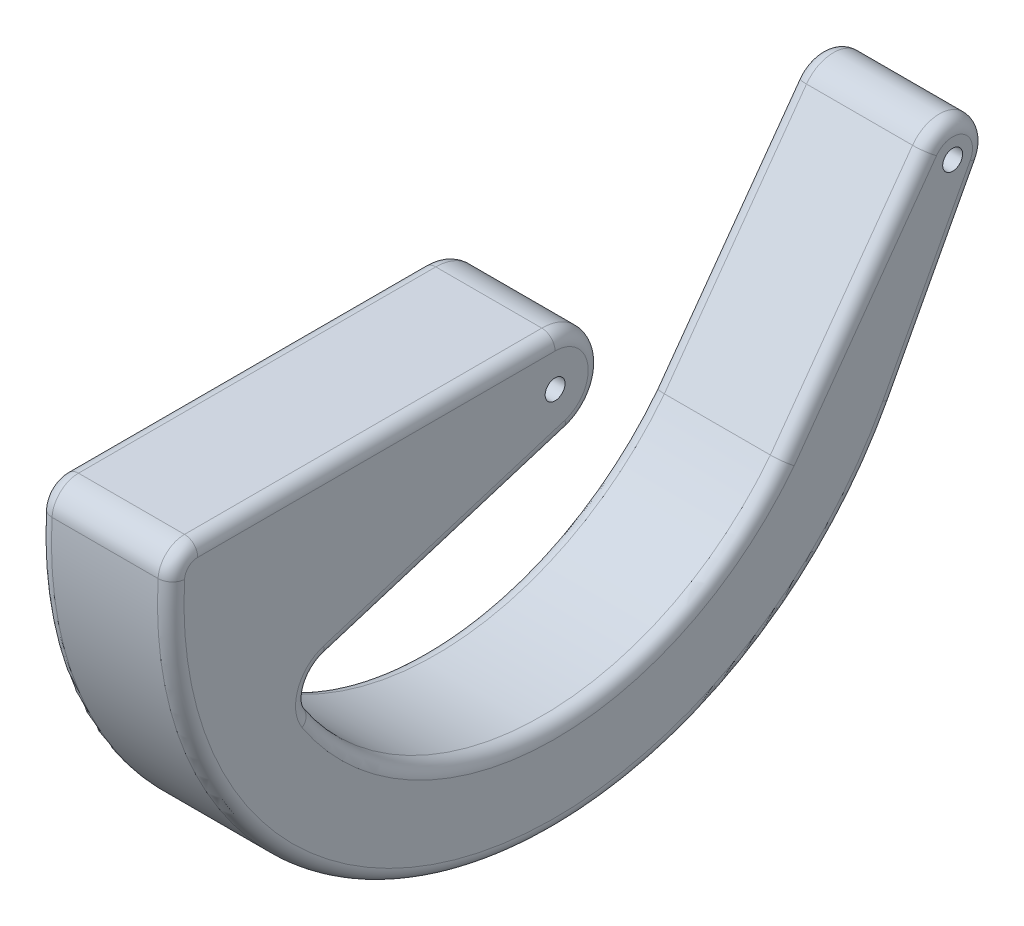
ISO-10303-21;
HEADER;
FILE_DESCRIPTION(('STEP AP214'),'2;1');
FILE_NAME('part.step','',(''),(''),'','','');
FILE_SCHEMA(('AUTOMOTIVE_DESIGN { 1 0 10303 214 1 1 1 1 }'));
ENDSEC;
DATA;
#1=APPLICATION_CONTEXT('core data for automotive mechanical design processes');
#2=APPLICATION_PROTOCOL_DEFINITION('international standard','automotive_design',2000,#1);
#3=PRODUCT_CONTEXT('',#1,'mechanical');
#4=PRODUCT('Part','Part','',(#3));
#5=PRODUCT_RELATED_PRODUCT_CATEGORY('part','',(#4));
#6=PRODUCT_DEFINITION_FORMATION('','',#4);
#7=PRODUCT_DEFINITION_CONTEXT('part definition',#1,'design');
#8=PRODUCT_DEFINITION('design','',#6,#7);
#9=PRODUCT_DEFINITION_SHAPE('','',#8);
#10=(LENGTH_UNIT() NAMED_UNIT(*) SI_UNIT(.MILLI.,.METRE.));
#11=(NAMED_UNIT(*) PLANE_ANGLE_UNIT() SI_UNIT($,.RADIAN.));
#12=(NAMED_UNIT(*) SI_UNIT($,.STERADIAN.) SOLID_ANGLE_UNIT());
#13=UNCERTAINTY_MEASURE_WITH_UNIT(LENGTH_MEASURE(1.E-05),#10,'distance_accuracy_value','');
#14=(GEOMETRIC_REPRESENTATION_CONTEXT(3) GLOBAL_UNCERTAINTY_ASSIGNED_CONTEXT((#13)) GLOBAL_UNIT_ASSIGNED_CONTEXT((#10,
#11,#12)) REPRESENTATION_CONTEXT('',''));
#15=CARTESIAN_POINT('',(0.,0.,0.));
#16=DIRECTION('',(0.,0.,1.));
#17=DIRECTION('',(1.,0.,0.));
#18=AXIS2_PLACEMENT_3D('',#15,#16,#17);
#19=CARTESIAN_POINT('',(10.,0.,0.));
#20=DIRECTION('',(-1.,0.,0.));
#21=DIRECTION('',(0.,0.,1.));
#22=AXIS2_PLACEMENT_3D('',#19,#20,#21);
#23=PLANE('',#22);
#24=DIRECTION('',(0.,-0.811180975124152,0.58479519970382));
#25=VECTOR('',#24,1.);
#26=CARTESIAN_POINT('',(10.,-26.7080988215086,-37.0473315388297));
#27=LINE('',#26,#25);
#28=CARTESIAN_POINT('',(10.,1.75438559911146,-57.5664570746275));
#29=VERTEX_POINT('',#28);
#30=CARTESIAN_POINT('',(10.,-28.0317620519889,-36.0930785090532));
#31=VERTEX_POINT('',#30);
#32=EDGE_CURVE('E178',#29,#31,#27,.T.);
#33=ORIENTED_EDGE('',*,*,#32,.T.);
#34=CARTESIAN_POINT('',(10.,0.,0.));
#35=DIRECTION('',(-1.,0.,0.));
#36=DIRECTION('',(0.,0.,1.));
#37=AXIS2_PLACEMENT_3D('',#34,#35,#36);
#38=CIRCLE('',#37,45.7);
#39=CARTESIAN_POINT('',(10.,-25.1177019312162,38.1784107801068));
#40=VERTEX_POINT('',#39);
#41=EDGE_CURVE('E213',#31,#40,#38,.T.);
#42=ORIENTED_EDGE('',*,*,#41,.T.);
#43=CARTESIAN_POINT('',(10.,-21.819973012457,33.1659279643379));
#44=DIRECTION('',(-1.,0.,0.));
#45=DIRECTION('',(0.,0.,1.));
#46=AXIS2_PLACEMENT_3D('',#43,#44,#45);
#47=CIRCLE('',#46,6.);
#48=CARTESIAN_POINT('',(10.,-16.0900134937715,34.9456930932876));
#49=VERTEX_POINT('',#48);
#50=EDGE_CURVE('E211',#40,#49,#47,.T.);
#51=ORIENTED_EDGE('',*,*,#50,.T.);
#52=DIRECTION('',(0.,0.296627521491627,-0.954993253114248));
#53=VECTOR('',#52,1.);
#54=CARTESIAN_POINT('',(10.,-4.77496626557125,-1.48313760745814));
#55=LINE('',#54,#53);
#56=CARTESIAN_POINT('',(10.,-4.77496626557124,-1.48313760745814));
#57=VERTEX_POINT('',#56);
#58=EDGE_CURVE('E209',#49,#57,#55,.T.);
#59=ORIENTED_EDGE('',*,*,#58,.T.);
#60=CARTESIAN_POINT('',(10.,0.,0.));
#61=DIRECTION('',(-1.,0.,0.));
#62=DIRECTION('',(0.,0.,1.));
#63=AXIS2_PLACEMENT_3D('',#60,#61,#62);
#64=CIRCLE('',#63,5.);
#65=CARTESIAN_POINT('',(10.,5.,0.));
#66=VERTEX_POINT('',#65);
#67=EDGE_CURVE('E207',#57,#66,#64,.F.);
#68=ORIENTED_EDGE('',*,*,#67,.T.);
#69=DIRECTION('',(0.,0.,1.));
#70=VECTOR('',#69,1.);
#71=CARTESIAN_POINT('',(10.,5.,0.));
#72=LINE('',#71,#70);
#73=CARTESIAN_POINT('',(10.,4.99999999999999,53.9166022668343));
#74=VERTEX_POINT('',#73);
#75=EDGE_CURVE('E174',#66,#74,#72,.T.);
#76=ORIENTED_EDGE('',*,*,#75,.T.);
#77=CARTESIAN_POINT('',(10.,2.99999999999999,53.9166022668343));
#78=DIRECTION('',(-1.,0.,0.));
#79=DIRECTION('',(0.,0.,1.));
#80=AXIS2_PLACEMENT_3D('',#77,#78,#79);
#81=CIRCLE('',#80,2.);
#82=CARTESIAN_POINT('',(10.,3.11111111111111,55.9135134619022));
#83=VERTEX_POINT('',#82);
#84=EDGE_CURVE('E167',#74,#83,#81,.F.);
#85=ORIENTED_EDGE('',*,*,#84,.T.);
#86=CARTESIAN_POINT('',(10.,0.,0.));
#87=DIRECTION('',(-1.,0.,0.));
#88=DIRECTION('',(0.,0.,1.));
#89=AXIS2_PLACEMENT_3D('',#86,#87,#88);
#90=CIRCLE('',#89,56.);
#91=CARTESIAN_POINT('',(10.,-26.2497407394604,-49.4666666666667));
#92=VERTEX_POINT('',#91);
#93=EDGE_CURVE('E171',#83,#92,#90,.F.);
#94=ORIENTED_EDGE('',*,*,#93,.T.);
#95=DIRECTION('',(0.,0.883333333333334,-0.468745370347507));
#96=VECTOR('',#95,1.);
#97=CARTESIAN_POINT('',(10.,-26.2497407394604,-49.4666666666667));
#98=LINE('',#97,#96);
#99=CARTESIAN_POINT('',(10.,-1.40623611104253,-62.65));
#100=VERTEX_POINT('',#99);
#101=EDGE_CURVE('E194',#92,#100,#98,.T.);
#102=ORIENTED_EDGE('',*,*,#101,.T.);
#103=CARTESIAN_POINT('',(10.,0.,-60.));
#104=DIRECTION('',(-1.,0.,0.));
#105=DIRECTION('',(0.,0.,1.));
#106=AXIS2_PLACEMENT_3D('',#103,#104,#105);
#107=CIRCLE('',#106,3.);
#108=EDGE_CURVE('E197',#100,#29,#107,.F.);
#109=ORIENTED_EDGE('',*,*,#108,.T.);
#110=EDGE_LOOP('',(#33,#42,#51,#59,#68,#76,#85,#94,#102,#109));
#111=FACE_BOUND('',#110,.T.);
#112=CARTESIAN_POINT('',(10.,0.,0.));
#113=DIRECTION('',(1.,0.,0.));
#114=DIRECTION('',(0.,0.,-1.));
#115=AXIS2_PLACEMENT_3D('',#112,#113,#114);
#116=CIRCLE('',#115,1.5);
#117=CARTESIAN_POINT('',(10.,0.,-1.5));
#118=VERTEX_POINT('',#117);
#119=EDGE_CURVE('E444',#118,#118,#116,.T.);
#120=ORIENTED_EDGE('',*,*,#119,.F.);
#121=EDGE_LOOP('',(#120));
#122=FACE_BOUND('',#121,.T.);
#123=CARTESIAN_POINT('',(10.,0.,-60.));
#124=DIRECTION('',(1.,0.,0.));
#125=DIRECTION('',(0.,0.,-1.));
#126=AXIS2_PLACEMENT_3D('',#123,#124,#125);
#127=CIRCLE('',#126,1.5);
#128=CARTESIAN_POINT('',(10.,0.,-61.5));
#129=VERTEX_POINT('',#128);
#130=EDGE_CURVE('E757',#129,#129,#127,.T.);
#131=ORIENTED_EDGE('',*,*,#130,.F.);
#132=EDGE_LOOP('',(#131));
#133=FACE_BOUND('',#132,.T.);
#134=ADVANCED_FACE('F30',(#111,#122,#133),#23,.F.);
#135=CARTESIAN_POINT('',(-10.,0.,0.));
#136=DIRECTION('',(-1.,0.,0.));
#137=DIRECTION('',(0.,0.,1.));
#138=AXIS2_PLACEMENT_3D('',#135,#136,#137);
#139=PLANE('',#138);
#140=CARTESIAN_POINT('',(-10.,-21.819973012457,33.1659279643379));
#141=DIRECTION('',(-1.,0.,0.));
#142=DIRECTION('',(0.,0.,1.));
#143=AXIS2_PLACEMENT_3D('',#140,#141,#142);
#144=CIRCLE('',#143,6.);
#145=CARTESIAN_POINT('',(-10.,-16.0900134937715,34.9456930932876));
#146=VERTEX_POINT('',#145);
#147=CARTESIAN_POINT('',(-10.,-25.1177019312162,38.1784107801068));
#148=VERTEX_POINT('',#147);
#149=EDGE_CURVE('E47',#146,#148,#144,.F.);
#150=ORIENTED_EDGE('',*,*,#149,.T.);
#151=CARTESIAN_POINT('',(-10.,0.,0.));
#152=DIRECTION('',(-1.,0.,0.));
#153=DIRECTION('',(0.,0.,1.));
#154=AXIS2_PLACEMENT_3D('',#151,#152,#153);
#155=CIRCLE('',#154,45.7);
#156=CARTESIAN_POINT('',(-10.,-28.0317620519889,-36.0930785090532));
#157=VERTEX_POINT('',#156);
#158=EDGE_CURVE('E269',#148,#157,#155,.F.);
#159=ORIENTED_EDGE('',*,*,#158,.T.);
#160=DIRECTION('',(0.,-0.811180975124152,0.58479519970382));
#161=VECTOR('',#160,1.);
#162=CARTESIAN_POINT('',(-10.,1.75438559911145,-57.5664570746276));
#163=LINE('',#162,#161);
#164=CARTESIAN_POINT('',(-10.,1.75438559911146,-57.5664570746275));
#165=VERTEX_POINT('',#164);
#166=EDGE_CURVE('E259',#157,#165,#163,.F.);
#167=ORIENTED_EDGE('',*,*,#166,.T.);
#168=CARTESIAN_POINT('',(-10.,0.,-60.));
#169=DIRECTION('',(-1.,0.,0.));
#170=DIRECTION('',(0.,0.,1.));
#171=AXIS2_PLACEMENT_3D('',#168,#169,#170);
#172=CIRCLE('',#171,3.);
#173=CARTESIAN_POINT('',(-10.,-1.40623611104253,-62.65));
#174=VERTEX_POINT('',#173);
#175=EDGE_CURVE('E257',#165,#174,#172,.T.);
#176=ORIENTED_EDGE('',*,*,#175,.T.);
#177=DIRECTION('',(0.,0.883333333333334,-0.468745370347507));
#178=VECTOR('',#177,1.);
#179=CARTESIAN_POINT('',(-10.,-26.2497407394605,-49.4666666666667));
#180=LINE('',#179,#178);
#181=CARTESIAN_POINT('',(-10.,-26.2497407394604,-49.4666666666667));
#182=VERTEX_POINT('',#181);
#183=EDGE_CURVE('E255',#174,#182,#180,.F.);
#184=ORIENTED_EDGE('',*,*,#183,.T.);
#185=CARTESIAN_POINT('',(-10.,0.,0.));
#186=DIRECTION('',(-1.,0.,0.));
#187=DIRECTION('',(0.,0.,1.));
#188=AXIS2_PLACEMENT_3D('',#185,#186,#187);
#189=CIRCLE('',#188,56.);
#190=CARTESIAN_POINT('',(-10.,3.11111111111111,55.9135134619022));
#191=VERTEX_POINT('',#190);
#192=EDGE_CURVE('E253',#182,#191,#189,.T.);
#193=ORIENTED_EDGE('',*,*,#192,.T.);
#194=CARTESIAN_POINT('',(-10.,2.99999999999999,53.9166022668343));
#195=DIRECTION('',(-1.,0.,0.));
#196=DIRECTION('',(0.,0.,1.));
#197=AXIS2_PLACEMENT_3D('',#194,#195,#196);
#198=CIRCLE('',#197,2.);
#199=CARTESIAN_POINT('',(-10.,4.99999999999999,53.9166022668343));
#200=VERTEX_POINT('',#199);
#201=EDGE_CURVE('E261',#191,#200,#198,.T.);
#202=ORIENTED_EDGE('',*,*,#201,.T.);
#203=DIRECTION('',(0.,0.,1.));
#204=VECTOR('',#203,1.);
#205=CARTESIAN_POINT('',(-10.,5.,0.));
#206=LINE('',#205,#204);
#207=CARTESIAN_POINT('',(-10.,5.,0.));
#208=VERTEX_POINT('',#207);
#209=EDGE_CURVE('E263',#200,#208,#206,.F.);
#210=ORIENTED_EDGE('',*,*,#209,.T.);
#211=CARTESIAN_POINT('',(-10.,0.,0.));
#212=DIRECTION('',(-1.,0.,0.));
#213=DIRECTION('',(0.,0.,1.));
#214=AXIS2_PLACEMENT_3D('',#211,#212,#213);
#215=CIRCLE('',#214,5.);
#216=CARTESIAN_POINT('',(-10.,-4.77496626557124,-1.48313760745814));
#217=VERTEX_POINT('',#216);
#218=EDGE_CURVE('E265',#208,#217,#215,.T.);
#219=ORIENTED_EDGE('',*,*,#218,.T.);
#220=DIRECTION('',(0.,0.296627521491627,-0.954993253114248));
#221=VECTOR('',#220,1.);
#222=CARTESIAN_POINT('',(-10.,-16.0900134937715,34.9456930932876));
#223=LINE('',#222,#221);
#224=EDGE_CURVE('E52',#217,#146,#223,.F.);
#225=ORIENTED_EDGE('',*,*,#224,.T.);
#226=EDGE_LOOP('',(#150,#159,#167,#176,#184,#193,#202,#210,#219,#225));
#227=FACE_BOUND('',#226,.T.);
#228=CARTESIAN_POINT('',(-10.,0.,0.));
#229=DIRECTION('',(1.,0.,0.));
#230=DIRECTION('',(0.,0.,-1.));
#231=AXIS2_PLACEMENT_3D('',#228,#229,#230);
#232=CIRCLE('',#231,1.5);
#233=CARTESIAN_POINT('',(-10.,0.,-1.5));
#234=VERTEX_POINT('',#233);
#235=EDGE_CURVE('E448',#234,#234,#232,.T.);
#236=ORIENTED_EDGE('',*,*,#235,.T.);
#237=EDGE_LOOP('',(#236));
#238=FACE_BOUND('',#237,.T.);
#239=CARTESIAN_POINT('',(-10.,0.,-60.));
#240=DIRECTION('',(1.,0.,0.));
#241=DIRECTION('',(0.,0.,-1.));
#242=AXIS2_PLACEMENT_3D('',#239,#240,#241);
#243=CIRCLE('',#242,1.5);
#244=CARTESIAN_POINT('',(-10.,0.,-61.5));
#245=VERTEX_POINT('',#244);
#246=EDGE_CURVE('E187',#245,#245,#243,.T.);
#247=ORIENTED_EDGE('',*,*,#246,.T.);
#248=EDGE_LOOP('',(#247));
#249=FACE_BOUND('',#248,.T.);
#250=ADVANCED_FACE('F371',(#227,#238,#249),#139,.T.);
#251=CARTESIAN_POINT('',(10.,0.,0.));
#252=DIRECTION('',(-1.,0.,0.));
#253=DIRECTION('',(0.,0.,1.));
#254=AXIS2_PLACEMENT_3D('',#251,#252,#253);
#255=CYLINDRICAL_SURFACE('',#254,7.);
#256=DIRECTION('',(-1.,0.,0.));
#257=VECTOR('',#256,1.);
#258=CARTESIAN_POINT('',(10.,7.,0.));
#259=LINE('',#258,#257);
#260=CARTESIAN_POINT('',(8.,7.,0.));
#261=VERTEX_POINT('',#260);
#262=CARTESIAN_POINT('',(-8.,7.,0.));
#263=VERTEX_POINT('',#262);
#264=EDGE_CURVE('E195',#261,#263,#259,.T.);
#265=ORIENTED_EDGE('',*,*,#264,.F.);
#266=CARTESIAN_POINT('',(8.,0.,0.));
#267=DIRECTION('',(-1.,0.,0.));
#268=DIRECTION('',(0.,0.,1.));
#269=AXIS2_PLACEMENT_3D('',#266,#267,#268);
#270=CIRCLE('',#269,7.);
#271=CARTESIAN_POINT('',(8.,-6.68495277179974,-2.0763926504414));
#272=VERTEX_POINT('',#271);
#273=EDGE_CURVE('E232',#261,#272,#270,.T.);
#274=ORIENTED_EDGE('',*,*,#273,.T.);
#275=DIRECTION('',(-1.,0.,0.));
#276=VECTOR('',#275,1.);
#277=CARTESIAN_POINT('',(10.,-6.68495277179974,-2.0763926504414));
#278=LINE('',#277,#276);
#279=CARTESIAN_POINT('',(-8.,-6.68495277179974,-2.0763926504414));
#280=VERTEX_POINT('',#279);
#281=EDGE_CURVE('E436',#272,#280,#278,.T.);
#282=ORIENTED_EDGE('',*,*,#281,.T.);
#283=CARTESIAN_POINT('',(-8.,0.,0.));
#284=DIRECTION('',(-1.,0.,0.));
#285=DIRECTION('',(0.,0.,1.));
#286=AXIS2_PLACEMENT_3D('',#283,#284,#285);
#287=CIRCLE('',#286,7.);
#288=EDGE_CURVE('E230',#280,#263,#287,.F.);
#289=ORIENTED_EDGE('',*,*,#288,.T.);
#290=EDGE_LOOP('',(#265,#274,#282,#289));
#291=FACE_BOUND('',#290,.T.);
#292=ADVANCED_FACE('F435',(#291),#255,.T.);
#293=CARTESIAN_POINT('',(10.,7.,0.));
#294=DIRECTION('',(0.,-1.,0.));
#295=DIRECTION('',(0.,0.,-1.));
#296=AXIS2_PLACEMENT_3D('',#293,#294,#295);
#297=PLANE('',#296);
#298=DIRECTION('',(-1.,0.,0.));
#299=VECTOR('',#298,1.);
#300=CARTESIAN_POINT('',(10.,6.99999999999999,53.9166022668343));
#301=LINE('',#300,#299);
#302=CARTESIAN_POINT('',(8.,6.99999999999999,53.9166022668343));
#303=VERTEX_POINT('',#302);
#304=CARTESIAN_POINT('',(-8.,6.99999999999999,53.9166022668343));
#305=VERTEX_POINT('',#304);
#306=EDGE_CURVE('E200',#303,#305,#301,.T.);
#307=ORIENTED_EDGE('',*,*,#306,.F.);
#308=DIRECTION('',(0.,0.,1.));
#309=VECTOR('',#308,1.);
#310=CARTESIAN_POINT('',(8.,7.,0.));
#311=LINE('',#310,#309);
#312=EDGE_CURVE('E236',#303,#261,#311,.F.);
#313=ORIENTED_EDGE('',*,*,#312,.T.);
#314=ORIENTED_EDGE('',*,*,#264,.T.);
#315=DIRECTION('',(0.,0.,1.));
#316=VECTOR('',#315,1.);
#317=CARTESIAN_POINT('',(-8.,6.99999999999999,53.9166022668343));
#318=LINE('',#317,#316);
#319=EDGE_CURVE('E234',#263,#305,#318,.T.);
#320=ORIENTED_EDGE('',*,*,#319,.T.);
#321=EDGE_LOOP('',(#307,#313,#314,#320));
#322=FACE_BOUND('',#321,.T.);
#323=ADVANCED_FACE('F417',(#322),#297,.F.);
#324=CARTESIAN_POINT('',(10.,2.99999999999999,53.9166022668343));
#325=DIRECTION('',(-1.,0.,0.));
#326=DIRECTION('',(0.,0.,1.));
#327=AXIS2_PLACEMENT_3D('',#324,#325,#326);
#328=CYLINDRICAL_SURFACE('',#327,4.);
#329=DIRECTION('',(-1.,0.,0.));
#330=VECTOR('',#329,1.);
#331=CARTESIAN_POINT('',(10.,3.22222222222222,57.9104246569702));
#332=LINE('',#331,#330);
#333=CARTESIAN_POINT('',(8.,3.22222222222222,57.9104246569702));
#334=VERTEX_POINT('',#333);
#335=CARTESIAN_POINT('',(-8.,3.22222222222222,57.9104246569702));
#336=VERTEX_POINT('',#335);
#337=EDGE_CURVE('E409',#334,#336,#332,.T.);
#338=ORIENTED_EDGE('',*,*,#337,.F.);
#339=CARTESIAN_POINT('',(8.,2.99999999999999,53.9166022668343));
#340=DIRECTION('',(-1.,0.,0.));
#341=DIRECTION('',(0.,0.,1.));
#342=AXIS2_PLACEMENT_3D('',#339,#340,#341);
#343=CIRCLE('',#342,4.);
#344=EDGE_CURVE('E184',#334,#303,#343,.T.);
#345=ORIENTED_EDGE('',*,*,#344,.T.);
#346=ORIENTED_EDGE('',*,*,#306,.T.);
#347=CARTESIAN_POINT('',(-8.,2.99999999999999,53.9166022668343));
#348=DIRECTION('',(-1.,0.,0.));
#349=DIRECTION('',(0.,0.,1.));
#350=AXIS2_PLACEMENT_3D('',#347,#348,#349);
#351=CIRCLE('',#350,4.);
#352=EDGE_CURVE('E238',#305,#336,#351,.F.);
#353=ORIENTED_EDGE('',*,*,#352,.T.);
#354=EDGE_LOOP('',(#338,#345,#346,#353));
#355=FACE_BOUND('',#354,.T.);
#356=ADVANCED_FACE('F415',(#355),#328,.T.);
#357=CARTESIAN_POINT('',(10.,0.,0.));
#358=DIRECTION('',(-1.,0.,0.));
#359=DIRECTION('',(0.,0.,1.));
#360=AXIS2_PLACEMENT_3D('',#357,#358,#359);
#361=CYLINDRICAL_SURFACE('',#360,58.);
#362=DIRECTION('',(-1.,0.,0.));
#363=VECTOR('',#362,1.);
#364=CARTESIAN_POINT('',(10.,-27.1872314801555,-51.2333333333334));
#365=LINE('',#364,#363);
#366=CARTESIAN_POINT('',(8.,-27.1872314801555,-51.2333333333334));
#367=VERTEX_POINT('',#366);
#368=CARTESIAN_POINT('',(-8.,-27.1872314801555,-51.2333333333334));
#369=VERTEX_POINT('',#368);
#370=EDGE_CURVE('E401',#367,#369,#365,.T.);
#371=ORIENTED_EDGE('',*,*,#370,.F.);
#372=CARTESIAN_POINT('',(8.,0.,0.));
#373=DIRECTION('',(-1.,0.,0.));
#374=DIRECTION('',(0.,0.,1.));
#375=AXIS2_PLACEMENT_3D('',#372,#373,#374);
#376=CIRCLE('',#375,58.);
#377=EDGE_CURVE('E11',#367,#334,#376,.T.);
#378=ORIENTED_EDGE('',*,*,#377,.T.);
#379=ORIENTED_EDGE('',*,*,#337,.T.);
#380=CARTESIAN_POINT('',(-8.,0.,0.));
#381=DIRECTION('',(-1.,0.,0.));
#382=DIRECTION('',(0.,0.,1.));
#383=AXIS2_PLACEMENT_3D('',#380,#381,#382);
#384=CIRCLE('',#383,58.);
#385=EDGE_CURVE('E39',#336,#369,#384,.F.);
#386=ORIENTED_EDGE('',*,*,#385,.T.);
#387=EDGE_LOOP('',(#371,#378,#379,#386));
#388=FACE_BOUND('',#387,.T.);
#389=ADVANCED_FACE('F484',(#388),#361,.T.);
#390=CARTESIAN_POINT('',(10.,-2.34372685173754,-64.4166666666667));
#391=DIRECTION('',(0.,0.468745370347507,0.883333333333334));
#392=DIRECTION('',(0.,-0.883333333333334,0.468745370347507));
#393=AXIS2_PLACEMENT_3D('',#390,#391,#392);
#394=PLANE('',#393);
#395=DIRECTION('',(-1.,0.,0.));
#396=VECTOR('',#395,1.);
#397=CARTESIAN_POINT('',(10.,-2.34372685173754,-64.4166666666667));
#398=LINE('',#397,#396);
#399=CARTESIAN_POINT('',(8.,-2.34372685173754,-64.4166666666667));
#400=VERTEX_POINT('',#399);
#401=CARTESIAN_POINT('',(-8.,-2.34372685173754,-64.4166666666667));
#402=VERTEX_POINT('',#401);
#403=EDGE_CURVE('E393',#400,#402,#398,.T.);
#404=ORIENTED_EDGE('',*,*,#403,.F.);
#405=DIRECTION('',(0.,0.883333333333334,-0.468745370347507));
#406=VECTOR('',#405,1.);
#407=CARTESIAN_POINT('',(8.,-2.34372685173754,-64.4166666666667));
#408=LINE('',#407,#406);
#409=EDGE_CURVE('E251',#400,#367,#408,.F.);
#410=ORIENTED_EDGE('',*,*,#409,.T.);
#411=ORIENTED_EDGE('',*,*,#370,.T.);
#412=DIRECTION('',(0.,0.883333333333334,-0.468745370347507));
#413=VECTOR('',#412,1.);
#414=CARTESIAN_POINT('',(-8.,-2.34372685173754,-64.4166666666667));
#415=LINE('',#414,#413);
#416=EDGE_CURVE('E249',#369,#402,#415,.T.);
#417=ORIENTED_EDGE('',*,*,#416,.T.);
#418=EDGE_LOOP('',(#404,#410,#411,#417));
#419=FACE_BOUND('',#418,.T.);
#420=ADVANCED_FACE('F481',(#419),#394,.F.);
#421=CARTESIAN_POINT('',(10.,0.,-60.));
#422=DIRECTION('',(-1.,0.,0.));
#423=DIRECTION('',(0.,0.,1.));
#424=AXIS2_PLACEMENT_3D('',#421,#422,#423);
#425=CYLINDRICAL_SURFACE('',#424,5.);
#426=DIRECTION('',(-1.,0.,0.));
#427=VECTOR('',#426,1.);
#428=CARTESIAN_POINT('',(10.,2.9239759985191,-55.9440951243792));
#429=LINE('',#428,#427);
#430=CARTESIAN_POINT('',(8.,2.9239759985191,-55.9440951243792));
#431=VERTEX_POINT('',#430);
#432=CARTESIAN_POINT('',(-8.,2.9239759985191,-55.9440951243792));
#433=VERTEX_POINT('',#432);
#434=EDGE_CURVE('E390',#431,#433,#429,.T.);
#435=ORIENTED_EDGE('',*,*,#434,.F.);
#436=CARTESIAN_POINT('',(8.,0.,-60.));
#437=DIRECTION('',(-1.,0.,0.));
#438=DIRECTION('',(0.,0.,1.));
#439=AXIS2_PLACEMENT_3D('',#436,#437,#438);
#440=CIRCLE('',#439,5.);
#441=EDGE_CURVE('E247',#431,#400,#440,.T.);
#442=ORIENTED_EDGE('',*,*,#441,.T.);
#443=ORIENTED_EDGE('',*,*,#403,.T.);
#444=CARTESIAN_POINT('',(-8.,0.,-60.));
#445=DIRECTION('',(-1.,0.,0.));
#446=DIRECTION('',(0.,0.,1.));
#447=AXIS2_PLACEMENT_3D('',#444,#445,#446);
#448=CIRCLE('',#447,5.);
#449=EDGE_CURVE('E245',#402,#433,#448,.F.);
#450=ORIENTED_EDGE('',*,*,#449,.T.);
#451=EDGE_LOOP('',(#435,#442,#443,#450));
#452=FACE_BOUND('',#451,.T.);
#453=ADVANCED_FACE('F389',(#452),#425,.T.);
#454=CARTESIAN_POINT('',(10.,2.92397599851909,-55.9440951243792));
#455=DIRECTION('',(0.,-0.584795199703819,-0.811180975124152));
#456=DIRECTION('',(0.,0.811180975124152,-0.58479519970382));
#457=AXIS2_PLACEMENT_3D('',#454,#455,#456);
#458=PLANE('',#457);
#459=DIRECTION('',(-1.,0.,0.));
#460=VECTOR('',#459,1.);
#461=CARTESIAN_POINT('',(10.,-26.8328739966015,-34.4918377747911));
#462=LINE('',#461,#460);
#463=CARTESIAN_POINT('',(8.,-26.8328739966015,-34.4918377747911));
#464=VERTEX_POINT('',#463);
#465=CARTESIAN_POINT('',(-8.,-26.8328739966015,-34.4918377747911));
#466=VERTEX_POINT('',#465);
#467=EDGE_CURVE('E399',#464,#466,#462,.T.);
#468=ORIENTED_EDGE('',*,*,#467,.F.);
#469=DIRECTION('',(0.,-0.811180975124152,0.58479519970382));
#470=VECTOR('',#469,1.);
#471=CARTESIAN_POINT('',(8.,2.92397599851909,-55.9440951243792));
#472=LINE('',#471,#470);
#473=EDGE_CURVE('E243',#464,#431,#472,.F.);
#474=ORIENTED_EDGE('',*,*,#473,.T.);
#475=ORIENTED_EDGE('',*,*,#434,.T.);
#476=DIRECTION('',(0.,-0.811180975124152,0.58479519970382));
#477=VECTOR('',#476,1.);
#478=CARTESIAN_POINT('',(-8.,-26.8328739966015,-34.4918377747911));
#479=LINE('',#478,#477);
#480=EDGE_CURVE('E241',#433,#466,#479,.T.);
#481=ORIENTED_EDGE('',*,*,#480,.T.);
#482=EDGE_LOOP('',(#468,#474,#475,#481));
#483=FACE_BOUND('',#482,.T.);
#484=ADVANCED_FACE('F396',(#483),#458,.F.);
#485=CARTESIAN_POINT('',(10.,0.,0.));
#486=DIRECTION('',(-1.,0.,0.));
#487=DIRECTION('',(0.,0.,1.));
#488=AXIS2_PLACEMENT_3D('',#485,#486,#487);
#489=CYLINDRICAL_SURFACE('',#488,43.7);
#490=DIRECTION('',(-1.,0.,0.));
#491=VECTOR('',#490,1.);
#492=CARTESIAN_POINT('',(10.,-24.0184589582965,36.5075831748505));
#493=LINE('',#492,#491);
#494=CARTESIAN_POINT('',(8.,-24.0184589582965,36.5075831748505));
#495=VERTEX_POINT('',#494);
#496=CARTESIAN_POINT('',(-8.,-24.0184589582965,36.5075831748505));
#497=VERTEX_POINT('',#496);
#498=EDGE_CURVE('E403',#495,#497,#493,.T.);
#499=ORIENTED_EDGE('',*,*,#498,.F.);
#500=CARTESIAN_POINT('',(8.,0.,0.));
#501=DIRECTION('',(-1.,0.,0.));
#502=DIRECTION('',(0.,0.,1.));
#503=AXIS2_PLACEMENT_3D('',#500,#501,#502);
#504=CIRCLE('',#503,43.7);
#505=EDGE_CURVE('E219',#495,#464,#504,.F.);
#506=ORIENTED_EDGE('',*,*,#505,.T.);
#507=ORIENTED_EDGE('',*,*,#467,.T.);
#508=CARTESIAN_POINT('',(-8.,0.,0.));
#509=DIRECTION('',(-1.,0.,0.));
#510=DIRECTION('',(0.,0.,1.));
#511=AXIS2_PLACEMENT_3D('',#508,#509,#510);
#512=CIRCLE('',#511,43.7);
#513=EDGE_CURVE('E216',#466,#497,#512,.T.);
#514=ORIENTED_EDGE('',*,*,#513,.T.);
#515=EDGE_LOOP('',(#499,#506,#507,#514));
#516=FACE_BOUND('',#515,.T.);
#517=ADVANCED_FACE('F459',(#516),#489,.F.);
#518=CARTESIAN_POINT('',(10.,-21.819973012457,33.1659279643379));
#519=DIRECTION('',(-1.,0.,0.));
#520=DIRECTION('',(0.,0.,1.));
#521=AXIS2_PLACEMENT_3D('',#518,#519,#520);
#522=CYLINDRICAL_SURFACE('',#521,4.);
#523=DIRECTION('',(-1.,0.,0.));
#524=VECTOR('',#523,1.);
#525=CARTESIAN_POINT('',(10.,-18.,34.3524380503044));
#526=LINE('',#525,#524);
#527=CARTESIAN_POINT('',(8.,-18.,34.3524380503044));
#528=VERTEX_POINT('',#527);
#529=CARTESIAN_POINT('',(-8.,-18.,34.3524380503044));
#530=VERTEX_POINT('',#529);
#531=EDGE_CURVE('E443',#528,#530,#526,.T.);
#532=ORIENTED_EDGE('',*,*,#531,.F.);
#533=CARTESIAN_POINT('',(8.,-21.819973012457,33.1659279643379));
#534=DIRECTION('',(-1.,0.,0.));
#535=DIRECTION('',(0.,0.,1.));
#536=AXIS2_PLACEMENT_3D('',#533,#534,#535);
#537=CIRCLE('',#536,4.);
#538=EDGE_CURVE('E224',#528,#495,#537,.F.);
#539=ORIENTED_EDGE('',*,*,#538,.T.);
#540=ORIENTED_EDGE('',*,*,#498,.T.);
#541=CARTESIAN_POINT('',(-8.,-21.819973012457,33.1659279643379));
#542=DIRECTION('',(-1.,0.,0.));
#543=DIRECTION('',(0.,0.,1.));
#544=AXIS2_PLACEMENT_3D('',#541,#542,#543);
#545=CIRCLE('',#544,4.);
#546=EDGE_CURVE('E222',#497,#530,#545,.T.);
#547=ORIENTED_EDGE('',*,*,#546,.T.);
#548=EDGE_LOOP('',(#532,#539,#540,#547));
#549=FACE_BOUND('',#548,.T.);
#550=ADVANCED_FACE('F454',(#549),#522,.F.);
#551=CARTESIAN_POINT('',(10.,-6.68495277179974,-2.0763926504414));
#552=DIRECTION('',(0.,0.954993253114248,0.296627521491627));
#553=DIRECTION('',(0.,-0.296627521491627,0.954993253114248));
#554=AXIS2_PLACEMENT_3D('',#551,#552,#553);
#555=PLANE('',#554);
#556=ORIENTED_EDGE('',*,*,#281,.F.);
#557=DIRECTION('',(0.,0.296627521491627,-0.954993253114248));
#558=VECTOR('',#557,1.);
#559=CARTESIAN_POINT('',(8.,-6.68495277179974,-2.0763926504414));
#560=LINE('',#559,#558);
#561=EDGE_CURVE('E228',#272,#528,#560,.F.);
#562=ORIENTED_EDGE('',*,*,#561,.T.);
#563=ORIENTED_EDGE('',*,*,#531,.T.);
#564=DIRECTION('',(0.,0.296627521491627,-0.954993253114248));
#565=VECTOR('',#564,1.);
#566=CARTESIAN_POINT('',(-8.,-6.68495277179974,-2.0763926504414));
#567=LINE('',#566,#565);
#568=EDGE_CURVE('E226',#530,#280,#567,.T.);
#569=ORIENTED_EDGE('',*,*,#568,.T.);
#570=EDGE_LOOP('',(#556,#562,#563,#569));
#571=FACE_BOUND('',#570,.T.);
#572=ADVANCED_FACE('F439',(#571),#555,.F.);
#573=CARTESIAN_POINT('',(10.,0.,0.));
#574=DIRECTION('',(-1.,0.,0.));
#575=DIRECTION('',(0.,0.,1.));
#576=AXIS2_PLACEMENT_3D('',#573,#574,#575);
#577=CYLINDRICAL_SURFACE('',#576,1.5);
#578=ORIENTED_EDGE('',*,*,#119,.T.);
#579=EDGE_LOOP('',(#578));
#580=FACE_BOUND('',#579,.T.);
#581=ORIENTED_EDGE('',*,*,#235,.F.);
#582=EDGE_LOOP('',(#581));
#583=FACE_BOUND('',#582,.T.);
#584=ADVANCED_FACE('F500',(#580,#583),#577,.F.);
#585=CARTESIAN_POINT('',(10.,0.,-60.));
#586=DIRECTION('',(-1.,0.,0.));
#587=DIRECTION('',(0.,0.,1.));
#588=AXIS2_PLACEMENT_3D('',#585,#586,#587);
#589=CYLINDRICAL_SURFACE('',#588,1.5);
#590=ORIENTED_EDGE('',*,*,#130,.T.);
#591=EDGE_LOOP('',(#590));
#592=FACE_BOUND('',#591,.T.);
#593=ORIENTED_EDGE('',*,*,#246,.F.);
#594=EDGE_LOOP('',(#593));
#595=FACE_BOUND('',#594,.T.);
#596=ADVANCED_FACE('F319',(#592,#595),#589,.F.);
#597=CARTESIAN_POINT('',(8.,2.99999999999999,53.9166022668343));
#598=DIRECTION('',(-1.,0.,0.));
#599=DIRECTION('',(0.,0.,1.));
#600=AXIS2_PLACEMENT_3D('',#597,#598,#599);
#601=DEGENERATE_TOROIDAL_SURFACE('',#600,2.,2.,.T.);
#602=CARTESIAN_POINT('',(8.,4.99999999999999,53.9166022668343));
#603=DIRECTION('',(0.,0.,-1.));
#604=DIRECTION('',(-1.,0.,0.));
#605=AXIS2_PLACEMENT_3D('',#602,#603,#604);
#606=CIRCLE('',#605,2.);
#607=EDGE_CURVE('E188',#303,#74,#606,.T.);
#608=ORIENTED_EDGE('',*,*,#607,.F.);
#609=ORIENTED_EDGE('',*,*,#344,.F.);
#610=CARTESIAN_POINT('',(8.,3.1111111111111,55.9135134619022));
#611=DIRECTION('',(0.,-0.998455597533968,0.0555555555555554));
#612=DIRECTION('',(0.,-0.0555555555555554,-0.998455597533968));
#613=AXIS2_PLACEMENT_3D('',#610,#611,#612);
#614=CIRCLE('',#613,2.);
#615=EDGE_CURVE('E182',#83,#334,#614,.T.);
#616=ORIENTED_EDGE('',*,*,#615,.F.);
#617=ORIENTED_EDGE('',*,*,#84,.F.);
#618=EDGE_LOOP('',(#608,#609,#616,#617));
#619=FACE_BOUND('',#618,.T.);
#620=ADVANCED_FACE('F183',(#619),#601,.T.);
#621=CARTESIAN_POINT('',(8.,0.,0.));
#622=DIRECTION('',(-1.,0.,0.));
#623=DIRECTION('',(0.,0.,1.));
#624=AXIS2_PLACEMENT_3D('',#621,#622,#623);
#625=TOROIDAL_SURFACE('',#624,56.,2.);
#626=ORIENTED_EDGE('',*,*,#615,.T.);
#627=ORIENTED_EDGE('',*,*,#377,.F.);
#628=CARTESIAN_POINT('',(8.,-26.2497407394604,-49.4666666666667));
#629=DIRECTION('',(0.,0.883333333333333,-0.468745370347509));
#630=DIRECTION('',(0.,0.468745370347509,0.883333333333333));
#631=AXIS2_PLACEMENT_3D('',#628,#629,#630);
#632=CIRCLE('',#631,2.);
#633=EDGE_CURVE('E192',#92,#367,#632,.T.);
#634=ORIENTED_EDGE('',*,*,#633,.F.);
#635=ORIENTED_EDGE('',*,*,#93,.F.);
#636=EDGE_LOOP('',(#626,#627,#634,#635));
#637=FACE_BOUND('',#636,.T.);
#638=ADVANCED_FACE('F190',(#637),#625,.T.);
#639=CARTESIAN_POINT('',(8.,5.,0.));
#640=DIRECTION('',(0.,0.,1.));
#641=DIRECTION('',(0.,-1.,0.));
#642=AXIS2_PLACEMENT_3D('',#639,#640,#641);
#643=CYLINDRICAL_SURFACE('',#642,2.);
#644=ORIENTED_EDGE('',*,*,#607,.T.);
#645=ORIENTED_EDGE('',*,*,#75,.F.);
#646=CARTESIAN_POINT('',(8.,5.,0.));
#647=DIRECTION('',(0.,0.,-1.));
#648=DIRECTION('',(-1.,0.,0.));
#649=AXIS2_PLACEMENT_3D('',#646,#647,#648);
#650=CIRCLE('',#649,2.);
#651=EDGE_CURVE('E423',#261,#66,#650,.T.);
#652=ORIENTED_EDGE('',*,*,#651,.F.);
#653=ORIENTED_EDGE('',*,*,#312,.F.);
#654=EDGE_LOOP('',(#644,#645,#652,#653));
#655=FACE_BOUND('',#654,.T.);
#656=ADVANCED_FACE('F310',(#655),#643,.T.);
#657=CARTESIAN_POINT('',(8.,-26.2497407394604,-49.4666666666667));
#658=DIRECTION('',(0.,0.883333333333334,-0.468745370347507));
#659=DIRECTION('',(0.,0.468745370347507,0.883333333333334));
#660=AXIS2_PLACEMENT_3D('',#657,#658,#659);
#661=CYLINDRICAL_SURFACE('',#660,2.);
#662=ORIENTED_EDGE('',*,*,#633,.T.);
#663=ORIENTED_EDGE('',*,*,#409,.F.);
#664=CARTESIAN_POINT('',(8.,-1.40623611104253,-62.65));
#665=DIRECTION('',(0.,0.883333333333333,-0.468745370347508));
#666=DIRECTION('',(0.,0.468745370347508,0.883333333333333));
#667=AXIS2_PLACEMENT_3D('',#664,#665,#666);
#668=CIRCLE('',#667,2.);
#669=EDGE_CURVE('E426',#100,#400,#668,.T.);
#670=ORIENTED_EDGE('',*,*,#669,.F.);
#671=ORIENTED_EDGE('',*,*,#101,.F.);
#672=EDGE_LOOP('',(#662,#663,#670,#671));
#673=FACE_BOUND('',#672,.T.);
#674=ADVANCED_FACE('F306',(#673),#661,.T.);
#675=CARTESIAN_POINT('',(8.,0.,0.));
#676=DIRECTION('',(-1.,0.,0.));
#677=DIRECTION('',(0.,0.,1.));
#678=AXIS2_PLACEMENT_3D('',#675,#676,#677);
#679=TOROIDAL_SURFACE('',#678,5.,2.);
#680=ORIENTED_EDGE('',*,*,#651,.T.);
#681=ORIENTED_EDGE('',*,*,#67,.F.);
#682=CARTESIAN_POINT('',(8.,-4.77496626557124,-1.48313760745814));
#683=DIRECTION('',(0.,-0.296627521491628,0.954993253114248));
#684=DIRECTION('',(0.,-0.954993253114248,-0.296627521491628));
#685=AXIS2_PLACEMENT_3D('',#682,#683,#684);
#686=CIRCLE('',#685,2.);
#687=EDGE_CURVE('E430',#272,#57,#686,.T.);
#688=ORIENTED_EDGE('',*,*,#687,.F.);
#689=ORIENTED_EDGE('',*,*,#273,.F.);
#690=EDGE_LOOP('',(#680,#681,#688,#689));
#691=FACE_BOUND('',#690,.T.);
#692=ADVANCED_FACE('F302',(#691),#679,.T.);
#693=CARTESIAN_POINT('',(8.,0.,-60.));
#694=DIRECTION('',(-1.,0.,0.));
#695=DIRECTION('',(0.,0.,1.));
#696=AXIS2_PLACEMENT_3D('',#693,#694,#695);
#697=TOROIDAL_SURFACE('',#696,3.,2.);
#698=ORIENTED_EDGE('',*,*,#669,.T.);
#699=ORIENTED_EDGE('',*,*,#441,.F.);
#700=CARTESIAN_POINT('',(8.,1.75438559911146,-57.5664570746275));
#701=DIRECTION('',(0.,-0.811180975124153,0.584795199703818));
#702=DIRECTION('',(0.,-0.584795199703818,-0.811180975124153));
#703=AXIS2_PLACEMENT_3D('',#700,#701,#702);
#704=CIRCLE('',#703,2.);
#705=EDGE_CURVE('E473',#29,#431,#704,.T.);
#706=ORIENTED_EDGE('',*,*,#705,.F.);
#707=ORIENTED_EDGE('',*,*,#108,.F.);
#708=EDGE_LOOP('',(#698,#699,#706,#707));
#709=FACE_BOUND('',#708,.T.);
#710=ADVANCED_FACE('F298',(#709),#697,.T.);
#711=CARTESIAN_POINT('',(8.,-4.77496626557125,-1.48313760745814));
#712=DIRECTION('',(0.,0.296627521491627,-0.954993253114248));
#713=DIRECTION('',(0.,0.954993253114248,0.296627521491627));
#714=AXIS2_PLACEMENT_3D('',#711,#712,#713);
#715=CYLINDRICAL_SURFACE('',#714,2.);
#716=ORIENTED_EDGE('',*,*,#687,.T.);
#717=ORIENTED_EDGE('',*,*,#58,.F.);
#718=CARTESIAN_POINT('',(8.,-16.0900134937715,34.9456930932876));
#719=DIRECTION('',(0.,-0.296627521491628,0.954993253114248));
#720=DIRECTION('',(0.,-0.954993253114248,-0.296627521491628));
#721=AXIS2_PLACEMENT_3D('',#718,#719,#720);
#722=CIRCLE('',#721,2.);
#723=EDGE_CURVE('E281',#528,#49,#722,.T.);
#724=ORIENTED_EDGE('',*,*,#723,.F.);
#725=ORIENTED_EDGE('',*,*,#561,.F.);
#726=EDGE_LOOP('',(#716,#717,#724,#725));
#727=FACE_BOUND('',#726,.T.);
#728=ADVANCED_FACE('F291',(#727),#715,.T.);
#729=CARTESIAN_POINT('',(8.,-26.7080988215086,-37.0473315388297));
#730=DIRECTION('',(0.,-0.811180975124152,0.58479519970382));
#731=DIRECTION('',(0.,-0.58479519970382,-0.811180975124152));
#732=AXIS2_PLACEMENT_3D('',#729,#730,#731);
#733=CYLINDRICAL_SURFACE('',#732,2.);
#734=ORIENTED_EDGE('',*,*,#705,.T.);
#735=ORIENTED_EDGE('',*,*,#473,.F.);
#736=CARTESIAN_POINT('',(8.,-26.8328739966015,-34.4918377747911));
#737=CARTESIAN_POINT('',(8.05626075846773,-26.8328742142423,-34.4918380749283));
#738=CARTESIAN_POINT('',(8.11249455960872,-26.8342983372291,-34.4937393201484));
#739=CARTESIAN_POINT('',(8.22455974348117,-26.8399796953037,-34.5013241589466));
#740=CARTESIAN_POINT('',(8.28039114546821,-26.844236793906,-34.5070075703095));
#741=CARTESIAN_POINT('',(8.44659148358929,-26.8612177610862,-34.5296780514891));
#742=CARTESIAN_POINT('',(8.55584698727059,-26.8781514085698,-34.5522855114722));
#743=CARTESIAN_POINT('',(8.76806140948276,-26.9227733777993,-34.6118603834735));
#744=CARTESIAN_POINT('',(8.87101730072419,-26.9504668239263,-34.6488346377144));
#745=CARTESIAN_POINT('',(9.06770328602806,-27.015815463786,-34.7360869280492));
#746=CARTESIAN_POINT('',(9.16143559532538,-27.0534682575231,-34.7863617589817));
#747=CARTESIAN_POINT('',(9.33702548086057,-27.1376671393632,-34.898791615533));
#748=CARTESIAN_POINT('',(9.41888286712628,-27.1842133697135,-34.9609468311745));
#749=CARTESIAN_POINT('',(9.56843268944443,-27.284897274063,-35.0954022801102));
#750=CARTESIAN_POINT('',(9.63612001072155,-27.3390376774919,-35.167706160953));
#751=CARTESIAN_POINT('',(9.75539748520884,-27.4533749125534,-35.3204120037057));
#752=CARTESIAN_POINT('',(9.80697996956119,-27.5135746115351,-35.4008177995825));
#753=CARTESIAN_POINT('',(9.89250415874733,-27.6382751059351,-35.5673855195204));
#754=CARTESIAN_POINT('',(9.92646336599543,-27.7027715619348,-35.6535416363244));
#755=CARTESIAN_POINT('',(9.96565031166878,-27.8070472764665,-35.7928456737119));
#756=CARTESIAN_POINT('',(9.97695138398998,-27.84604892342,-35.8449508357862));
#757=CARTESIAN_POINT('',(9.99306149292463,-27.924492335169,-35.9497534099381));
#758=CARTESIAN_POINT('',(9.99787973037431,-27.9639333959334,-36.0024498753904));
#759=CARTESIAN_POINT('',(9.99981370385013,-28.012853560315,-36.0678138372154));
#760=CARTESIAN_POINT('',(10.0000005026506,-28.0223085972063,-36.0804471686649));
#761=CARTESIAN_POINT('',(10.,-28.0317620519888,-36.0930785090532));
#762=B_SPLINE_CURVE_WITH_KNOTS('',3,(#736,#737,#738,#739,#740,#741,#742,#743,#744,#745,#746,
#747,#748,#749,#750,#751,#752,#753,#754,#755,#756,#757,#758,#759,#760,#761),.UNSPECIFIED.,.F.,
.F.,(4,2,2,2,2,2,2,2,2,2,2,2,4),(0.,0.168678596684601,0.337349067450398,0.674155592985967,
1.01112272048476,1.34800871978396,1.68490010790996,2.02191289025654,2.3590859086325,
2.69592342242486,2.89382751598318,3.09145043460312,3.13878774883333),.UNSPECIFIED.);
#763=EDGE_CURVE('E274',#31,#464,#762,.F.);
#764=ORIENTED_EDGE('',*,*,#763,.F.);
#765=ORIENTED_EDGE('',*,*,#32,.F.);
#766=EDGE_LOOP('',(#734,#735,#764,#765));
#767=FACE_BOUND('',#766,.T.);
#768=ADVANCED_FACE('F286',(#767),#733,.T.);
#769=CARTESIAN_POINT('',(8.,-21.819973012457,33.1659279643379));
#770=DIRECTION('',(-1.,0.,0.));
#771=DIRECTION('',(0.,0.,1.));
#772=AXIS2_PLACEMENT_3D('',#769,#770,#771);
#773=TOROIDAL_SURFACE('',#772,6.,2.);
#774=ORIENTED_EDGE('',*,*,#723,.T.);
#775=ORIENTED_EDGE('',*,*,#50,.F.);
#776=CARTESIAN_POINT('',(8.,-25.1177019312162,38.1784107801068));
#777=DIRECTION('',(0.,-0.835413802628159,-0.549621486459871));
#778=DIRECTION('',(0.,0.549621486459871,-0.835413802628159));
#779=AXIS2_PLACEMENT_3D('',#776,#777,#778);
#780=CIRCLE('',#779,2.);
#781=EDGE_CURVE('E272',#495,#40,#780,.T.);
#782=ORIENTED_EDGE('',*,*,#781,.F.);
#783=ORIENTED_EDGE('',*,*,#538,.F.);
#784=EDGE_LOOP('',(#774,#775,#782,#783));
#785=FACE_BOUND('',#784,.T.);
#786=ADVANCED_FACE('F290',(#785),#773,.T.);
#787=CARTESIAN_POINT('',(8.,0.,0.));
#788=DIRECTION('',(-1.,0.,0.));
#789=DIRECTION('',(0.,0.,1.));
#790=AXIS2_PLACEMENT_3D('',#787,#788,#789);
#791=TOROIDAL_SURFACE('',#790,45.7,2.);
#792=ORIENTED_EDGE('',*,*,#763,.T.);
#793=ORIENTED_EDGE('',*,*,#505,.F.);
#794=ORIENTED_EDGE('',*,*,#781,.T.);
#795=ORIENTED_EDGE('',*,*,#41,.F.);
#796=EDGE_LOOP('',(#792,#793,#794,#795));
#797=FACE_BOUND('',#796,.T.);
#798=ADVANCED_FACE('F283',(#797),#791,.T.);
#799=CARTESIAN_POINT('',(-8.,2.99999999999999,53.9166022668343));
#800=DIRECTION('',(-1.,0.,0.));
#801=DIRECTION('',(0.,0.,1.));
#802=AXIS2_PLACEMENT_3D('',#799,#800,#801);
#803=DEGENERATE_TOROIDAL_SURFACE('',#802,2.,2.,.T.);
#804=CARTESIAN_POINT('',(-8.,4.99999999999999,53.9166022668343));
#805=DIRECTION('',(0.,0.,-1.));
#806=DIRECTION('',(-1.,0.,0.));
#807=AXIS2_PLACEMENT_3D('',#804,#805,#806);
#808=CIRCLE('',#807,2.);
#809=EDGE_CURVE('E355',#200,#305,#808,.T.);
#810=ORIENTED_EDGE('',*,*,#809,.F.);
#811=ORIENTED_EDGE('',*,*,#201,.F.);
#812=CARTESIAN_POINT('',(-8.,3.1111111111111,55.9135134619022));
#813=DIRECTION('',(0.,-0.998455597533968,0.0555555555555554));
#814=DIRECTION('',(0.,-0.0555555555555554,-0.998455597533968));
#815=AXIS2_PLACEMENT_3D('',#812,#813,#814);
#816=CIRCLE('',#815,2.);
#817=EDGE_CURVE('E34',#336,#191,#816,.T.);
#818=ORIENTED_EDGE('',*,*,#817,.F.);
#819=ORIENTED_EDGE('',*,*,#352,.F.);
#820=EDGE_LOOP('',(#810,#811,#818,#819));
#821=FACE_BOUND('',#820,.T.);
#822=ADVANCED_FACE('F32',(#821),#803,.T.);
#823=CARTESIAN_POINT('',(-8.,0.,0.));
#824=DIRECTION('',(-1.,0.,0.));
#825=DIRECTION('',(0.,0.,1.));
#826=AXIS2_PLACEMENT_3D('',#823,#824,#825);
#827=TOROIDAL_SURFACE('',#826,56.,2.);
#828=ORIENTED_EDGE('',*,*,#817,.T.);
#829=ORIENTED_EDGE('',*,*,#192,.F.);
#830=CARTESIAN_POINT('',(-8.,-26.2497407394604,-49.4666666666667));
#831=DIRECTION('',(0.,0.883333333333333,-0.468745370347508));
#832=DIRECTION('',(0.,0.468745370347508,0.883333333333334));
#833=AXIS2_PLACEMENT_3D('',#830,#831,#832);
#834=CIRCLE('',#833,2.);
#835=EDGE_CURVE('E353',#369,#182,#834,.T.);
#836=ORIENTED_EDGE('',*,*,#835,.F.);
#837=ORIENTED_EDGE('',*,*,#385,.F.);
#838=EDGE_LOOP('',(#828,#829,#836,#837));
#839=FACE_BOUND('',#838,.T.);
#840=ADVANCED_FACE('F366',(#839),#827,.T.);
#841=CARTESIAN_POINT('',(-8.,5.,0.));
#842=DIRECTION('',(0.,0.,-1.));
#843=DIRECTION('',(0.,1.,0.));
#844=AXIS2_PLACEMENT_3D('',#841,#842,#843);
#845=CYLINDRICAL_SURFACE('',#844,2.);
#846=ORIENTED_EDGE('',*,*,#809,.T.);
#847=ORIENTED_EDGE('',*,*,#319,.F.);
#848=CARTESIAN_POINT('',(-8.,5.,0.));
#849=DIRECTION('',(0.,0.,-1.));
#850=DIRECTION('',(0.,1.,0.));
#851=AXIS2_PLACEMENT_3D('',#848,#849,#850);
#852=CIRCLE('',#851,2.);
#853=EDGE_CURVE('E350',#208,#263,#852,.T.);
#854=ORIENTED_EDGE('',*,*,#853,.F.);
#855=ORIENTED_EDGE('',*,*,#209,.F.);
#856=EDGE_LOOP('',(#846,#847,#854,#855));
#857=FACE_BOUND('',#856,.T.);
#858=ADVANCED_FACE('F596',(#857),#845,.T.);
#859=CARTESIAN_POINT('',(-8.,-1.40623611104253,-62.65));
#860=DIRECTION('',(0.,-0.883333333333334,0.468745370347507));
#861=DIRECTION('',(0.,-0.468745370347507,-0.883333333333334));
#862=AXIS2_PLACEMENT_3D('',#859,#860,#861);
#863=CYLINDRICAL_SURFACE('',#862,2.);
#864=ORIENTED_EDGE('',*,*,#835,.T.);
#865=ORIENTED_EDGE('',*,*,#183,.F.);
#866=CARTESIAN_POINT('',(-8.,-1.40623611104253,-62.65));
#867=DIRECTION('',(0.,0.883333333333334,-0.468745370347507));
#868=DIRECTION('',(0.,0.468745370347507,0.883333333333334));
#869=AXIS2_PLACEMENT_3D('',#866,#867,#868);
#870=CIRCLE('',#869,2.);
#871=EDGE_CURVE('E347',#402,#174,#870,.T.);
#872=ORIENTED_EDGE('',*,*,#871,.F.);
#873=ORIENTED_EDGE('',*,*,#416,.F.);
#874=EDGE_LOOP('',(#864,#865,#872,#873));
#875=FACE_BOUND('',#874,.T.);
#876=ADVANCED_FACE('F378',(#875),#863,.T.);
#877=CARTESIAN_POINT('',(-8.,0.,0.));
#878=DIRECTION('',(-1.,0.,0.));
#879=DIRECTION('',(0.,0.,1.));
#880=AXIS2_PLACEMENT_3D('',#877,#878,#879);
#881=TOROIDAL_SURFACE('',#880,5.,2.);
#882=ORIENTED_EDGE('',*,*,#853,.T.);
#883=ORIENTED_EDGE('',*,*,#288,.F.);
#884=CARTESIAN_POINT('',(-8.,-4.77496626557124,-1.48313760745814));
#885=DIRECTION('',(0.,-0.296627521491628,0.954993253114248));
#886=DIRECTION('',(0.,-0.954993253114248,-0.296627521491628));
#887=AXIS2_PLACEMENT_3D('',#884,#885,#886);
#888=CIRCLE('',#887,2.);
#889=EDGE_CURVE('E344',#217,#280,#888,.T.);
#890=ORIENTED_EDGE('',*,*,#889,.F.);
#891=ORIENTED_EDGE('',*,*,#218,.F.);
#892=EDGE_LOOP('',(#882,#883,#890,#891));
#893=FACE_BOUND('',#892,.T.);
#894=ADVANCED_FACE('F608',(#893),#881,.T.);
#895=CARTESIAN_POINT('',(-8.,0.,-60.));
#896=DIRECTION('',(-1.,0.,0.));
#897=DIRECTION('',(0.,0.,1.));
#898=AXIS2_PLACEMENT_3D('',#895,#896,#897);
#899=TOROIDAL_SURFACE('',#898,3.,2.);
#900=ORIENTED_EDGE('',*,*,#871,.T.);
#901=ORIENTED_EDGE('',*,*,#175,.F.);
#902=CARTESIAN_POINT('',(-8.,1.75438559911146,-57.5664570746275));
#903=DIRECTION('',(0.,-0.811180975124152,0.584795199703819));
#904=DIRECTION('',(0.,-0.584795199703819,-0.811180975124152));
#905=AXIS2_PLACEMENT_3D('',#902,#903,#904);
#906=CIRCLE('',#905,2.);
#907=EDGE_CURVE('E341',#433,#165,#906,.T.);
#908=ORIENTED_EDGE('',*,*,#907,.F.);
#909=ORIENTED_EDGE('',*,*,#449,.F.);
#910=EDGE_LOOP('',(#900,#901,#908,#909));
#911=FACE_BOUND('',#910,.T.);
#912=ADVANCED_FACE('F382',(#911),#899,.T.);
#913=CARTESIAN_POINT('',(-8.,-4.77496626557125,-1.48313760745814));
#914=DIRECTION('',(0.,-0.296627521491627,0.954993253114248));
#915=DIRECTION('',(0.,-0.954993253114248,-0.296627521491627));
#916=AXIS2_PLACEMENT_3D('',#913,#914,#915);
#917=CYLINDRICAL_SURFACE('',#916,2.);
#918=ORIENTED_EDGE('',*,*,#889,.T.);
#919=ORIENTED_EDGE('',*,*,#568,.F.);
#920=CARTESIAN_POINT('',(-8.,-16.0900134937715,34.9456930932876));
#921=DIRECTION('',(0.,-0.296627521491628,0.954993253114248));
#922=DIRECTION('',(0.,-0.954993253114248,-0.296627521491628));
#923=AXIS2_PLACEMENT_3D('',#920,#921,#922);
#924=CIRCLE('',#923,2.);
#925=EDGE_CURVE('E337',#146,#530,#924,.T.);
#926=ORIENTED_EDGE('',*,*,#925,.F.);
#927=ORIENTED_EDGE('',*,*,#224,.F.);
#928=EDGE_LOOP('',(#918,#919,#926,#927));
#929=FACE_BOUND('',#928,.T.);
#930=ADVANCED_FACE('F325',(#929),#917,.T.);
#931=CARTESIAN_POINT('',(-8.,1.75438559911145,-57.5664570746276));
#932=DIRECTION('',(0.,0.811180975124152,-0.58479519970382));
#933=DIRECTION('',(0.,0.58479519970382,0.811180975124152));
#934=AXIS2_PLACEMENT_3D('',#931,#932,#933);
#935=CYLINDRICAL_SURFACE('',#934,2.);
#936=ORIENTED_EDGE('',*,*,#907,.T.);
#937=ORIENTED_EDGE('',*,*,#166,.F.);
#938=CARTESIAN_POINT('',(-8.,-26.8328739966015,-34.4918377747911));
#939=CARTESIAN_POINT('',(-8.05626075846773,-26.8328742142423,-34.4918380749283));
#940=CARTESIAN_POINT('',(-8.11249455960872,-26.8342983372291,-34.4937393201484));
#941=CARTESIAN_POINT('',(-8.22455974348117,-26.8399796953036,-34.5013241589467));
#942=CARTESIAN_POINT('',(-8.28039114546822,-26.8442367939059,-34.5070075703096));
#943=CARTESIAN_POINT('',(-8.4465914835893,-26.861217761086,-34.5296780514893));
#944=CARTESIAN_POINT('',(-8.5558469872706,-26.8781514085697,-34.5522855114722));
#945=CARTESIAN_POINT('',(-8.76806140948277,-26.9227733777992,-34.6118603834736));
#946=CARTESIAN_POINT('',(-8.8710173007242,-26.9504668239263,-34.6488346377144));
#947=CARTESIAN_POINT('',(-9.06770328602807,-27.015815463786,-34.7360869280492));
#948=CARTESIAN_POINT('',(-9.16143559532539,-27.0534682575233,-34.7863617589817));
#949=CARTESIAN_POINT('',(-9.33702548086057,-27.1376671393632,-34.898791615533));
#950=CARTESIAN_POINT('',(-9.41888286712629,-27.1842133697134,-34.9609468311746));
#951=CARTESIAN_POINT('',(-9.56843268944444,-27.2848972740628,-35.0954022801104));
#952=CARTESIAN_POINT('',(-9.63612001072156,-27.3390376774917,-35.1677061609531));
#953=CARTESIAN_POINT('',(-9.75539748520884,-27.4533749125533,-35.3204120037058));
#954=CARTESIAN_POINT('',(-9.8069799695612,-27.513574611535,-35.4008177995825));
#955=CARTESIAN_POINT('',(-9.89250415874734,-27.6382751059352,-35.5673855195204));
#956=CARTESIAN_POINT('',(-9.92646336599544,-27.7027715619349,-35.6535416363243));
#957=CARTESIAN_POINT('',(-9.96565031166878,-27.8070472764664,-35.792845673712));
#958=CARTESIAN_POINT('',(-9.97695138398997,-27.8460489234198,-35.8449508357863));
#959=CARTESIAN_POINT('',(-9.99306149292462,-27.9244923351687,-35.9497534099381));
#960=CARTESIAN_POINT('',(-9.99787973037429,-27.9639333959332,-36.0024498753903));
#961=CARTESIAN_POINT('',(-9.99981370385013,-28.0128535603148,-36.0678138372152));
#962=CARTESIAN_POINT('',(-10.0000005026506,-28.0223085972061,-36.0804471686648));
#963=CARTESIAN_POINT('',(-10.,-28.0317620519886,-36.0930785090531));
#964=B_SPLINE_CURVE_WITH_KNOTS('',3,(#938,#939,#940,#941,#942,#943,#944,#945,#946,#947,#948,
#949,#950,#951,#952,#953,#954,#955,#956,#957,#958,#959,#960,#961,#962,#963),.UNSPECIFIED.,.F.,
.F.,(4,2,2,2,2,2,2,2,2,2,2,2,4),(0.,0.168678596684602,0.337349067450404,0.674155592985972,
1.01112272048478,1.34800871978397,1.68490010790997,2.02191289025655,2.35908590863252,
2.69592342242487,2.89382751598307,3.09145043460288,3.13878774883311),.UNSPECIFIED.);
#965=EDGE_CURVE('E331',#466,#157,#964,.T.);
#966=ORIENTED_EDGE('',*,*,#965,.F.);
#967=ORIENTED_EDGE('',*,*,#480,.F.);
#968=EDGE_LOOP('',(#936,#937,#966,#967));
#969=FACE_BOUND('',#968,.T.);
#970=ADVANCED_FACE('F320',(#969),#935,.T.);
#971=CARTESIAN_POINT('',(-8.,-21.819973012457,33.1659279643379));
#972=DIRECTION('',(-1.,0.,0.));
#973=DIRECTION('',(0.,0.,1.));
#974=AXIS2_PLACEMENT_3D('',#971,#972,#973);
#975=TOROIDAL_SURFACE('',#974,6.,2.);
#976=ORIENTED_EDGE('',*,*,#925,.T.);
#977=ORIENTED_EDGE('',*,*,#546,.F.);
#978=CARTESIAN_POINT('',(-8.,-25.1177019312162,38.1784107801068));
#979=DIRECTION('',(0.,-0.835413802628158,-0.549621486459874));
#980=DIRECTION('',(0.,0.549621486459874,-0.835413802628158));
#981=AXIS2_PLACEMENT_3D('',#978,#979,#980);
#982=CIRCLE('',#981,2.);
#983=EDGE_CURVE('E338',#148,#497,#982,.T.);
#984=ORIENTED_EDGE('',*,*,#983,.F.);
#985=ORIENTED_EDGE('',*,*,#149,.F.);
#986=EDGE_LOOP('',(#976,#977,#984,#985));
#987=FACE_BOUND('',#986,.T.);
#988=ADVANCED_FACE('F324',(#987),#975,.T.);
#989=CARTESIAN_POINT('',(-8.,0.,0.));
#990=DIRECTION('',(-1.,0.,0.));
#991=DIRECTION('',(0.,0.,1.));
#992=AXIS2_PLACEMENT_3D('',#989,#990,#991);
#993=TOROIDAL_SURFACE('',#992,45.7,2.);
#994=ORIENTED_EDGE('',*,*,#965,.T.);
#995=ORIENTED_EDGE('',*,*,#158,.F.);
#996=ORIENTED_EDGE('',*,*,#983,.T.);
#997=ORIENTED_EDGE('',*,*,#513,.F.);
#998=EDGE_LOOP('',(#994,#995,#996,#997));
#999=FACE_BOUND('',#998,.T.);
#1000=ADVANCED_FACE('F327',(#999),#993,.T.);
#1001=CLOSED_SHELL('',(#134,#250,#292,#323,#356,#389,#420,#453,#484,#517,#550,#572,#584,#596,
#620,#638,#656,#674,#692,#710,#728,#768,#786,#798,#822,#840,#858,#876,#894,#912,#930,#970,#988,#1000));
#1002=MANIFOLD_SOLID_BREP('B2',#1001);
#1003=ADVANCED_BREP_SHAPE_REPRESENTATION('',(#18,#1002),#14);
#1004=SHAPE_DEFINITION_REPRESENTATION(#9,#1003);
ENDSEC;
END-ISO-10303-21;
